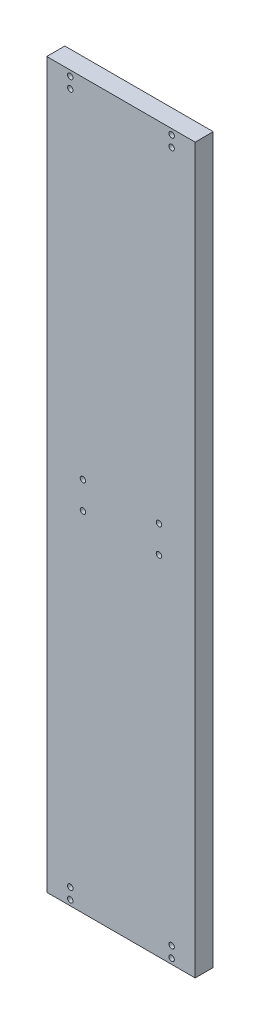
ISO-10303-21;
HEADER;
FILE_DESCRIPTION(('STEP AP214'),'2;1');
FILE_NAME('part.step','',(''),(''),'','','');
FILE_SCHEMA(('AUTOMOTIVE_DESIGN { 1 0 10303 214 1 1 1 1 }'));
ENDSEC;
DATA;
#1=APPLICATION_CONTEXT('core data for automotive mechanical design processes');
#2=APPLICATION_PROTOCOL_DEFINITION('international standard','automotive_design',2000,#1);
#3=PRODUCT_CONTEXT('',#1,'mechanical');
#4=PRODUCT('Part','Part','',(#3));
#5=PRODUCT_RELATED_PRODUCT_CATEGORY('part','',(#4));
#6=PRODUCT_DEFINITION_FORMATION('','',#4);
#7=PRODUCT_DEFINITION_CONTEXT('part definition',#1,'design');
#8=PRODUCT_DEFINITION('design','',#6,#7);
#9=PRODUCT_DEFINITION_SHAPE('','',#8);
#10=(LENGTH_UNIT() NAMED_UNIT(*) SI_UNIT(.MILLI.,.METRE.));
#11=(NAMED_UNIT(*) PLANE_ANGLE_UNIT() SI_UNIT($,.RADIAN.));
#12=(NAMED_UNIT(*) SI_UNIT($,.STERADIAN.) SOLID_ANGLE_UNIT());
#13=UNCERTAINTY_MEASURE_WITH_UNIT(LENGTH_MEASURE(1.E-05),#10,'distance_accuracy_value','');
#14=(GEOMETRIC_REPRESENTATION_CONTEXT(3) GLOBAL_UNCERTAINTY_ASSIGNED_CONTEXT((#13)) GLOBAL_UNIT_ASSIGNED_CONTEXT((#10,
#11,#12)) REPRESENTATION_CONTEXT('',''));
#15=CARTESIAN_POINT('',(0.,0.,0.));
#16=DIRECTION('',(0.,0.,1.));
#17=DIRECTION('',(1.,0.,0.));
#18=AXIS2_PLACEMENT_3D('',#15,#16,#17);
#19=CARTESIAN_POINT('',(41.,200.,10.));
#20=DIRECTION('',(-1.,0.,0.));
#21=DIRECTION('',(0.,-1.,0.));
#22=AXIS2_PLACEMENT_3D('',#19,#20,#21);
#23=PLANE('',#22);
#24=DIRECTION('',(0.,1.,0.));
#25=VECTOR('',#24,1.);
#26=CARTESIAN_POINT('',(41.,200.,0.));
#27=LINE('',#26,#25);
#28=CARTESIAN_POINT('',(41.,-200.,0.));
#29=VERTEX_POINT('',#28);
#30=CARTESIAN_POINT('',(41.,200.,0.));
#31=VERTEX_POINT('',#30);
#32=EDGE_CURVE('E97',#29,#31,#27,.T.);
#33=ORIENTED_EDGE('',*,*,#32,.T.);
#34=DIRECTION('',(0.,0.,-1.));
#35=VECTOR('',#34,1.);
#36=CARTESIAN_POINT('',(41.,200.,10.));
#37=LINE('',#36,#35);
#38=CARTESIAN_POINT('',(41.,200.,10.));
#39=VERTEX_POINT('',#38);
#40=EDGE_CURVE('E11',#39,#31,#37,.T.);
#41=ORIENTED_EDGE('',*,*,#40,.F.);
#42=DIRECTION('',(0.,1.,0.));
#43=VECTOR('',#42,1.);
#44=CARTESIAN_POINT('',(41.,200.,10.));
#45=LINE('',#44,#43);
#46=CARTESIAN_POINT('',(41.,-200.,10.));
#47=VERTEX_POINT('',#46);
#48=EDGE_CURVE('E85',#47,#39,#45,.T.);
#49=ORIENTED_EDGE('',*,*,#48,.F.);
#50=DIRECTION('',(0.,0.,-1.));
#51=VECTOR('',#50,1.);
#52=CARTESIAN_POINT('',(41.,-200.,10.));
#53=LINE('',#52,#51);
#54=EDGE_CURVE('E93',#47,#29,#53,.T.);
#55=ORIENTED_EDGE('',*,*,#54,.T.);
#56=EDGE_LOOP('',(#33,#41,#49,#55));
#57=FACE_BOUND('',#56,.T.);
#58=ADVANCED_FACE('F34',(#57),#23,.F.);
#59=CARTESIAN_POINT('',(-41.,200.,10.));
#60=DIRECTION('',(0.,-1.,0.));
#61=DIRECTION('',(0.,0.,-1.));
#62=AXIS2_PLACEMENT_3D('',#59,#60,#61);
#63=PLANE('',#62);
#64=DIRECTION('',(-1.,0.,0.));
#65=VECTOR('',#64,1.);
#66=CARTESIAN_POINT('',(-41.,200.,0.));
#67=LINE('',#66,#65);
#68=CARTESIAN_POINT('',(-41.,200.,0.));
#69=VERTEX_POINT('',#68);
#70=EDGE_CURVE('E89',#31,#69,#67,.T.);
#71=ORIENTED_EDGE('',*,*,#70,.T.);
#72=DIRECTION('',(0.,0.,-1.));
#73=VECTOR('',#72,1.);
#74=CARTESIAN_POINT('',(-41.,200.,10.));
#75=LINE('',#74,#73);
#76=CARTESIAN_POINT('',(-41.,200.,10.));
#77=VERTEX_POINT('',#76);
#78=EDGE_CURVE('E42',#77,#69,#75,.T.);
#79=ORIENTED_EDGE('',*,*,#78,.F.);
#80=DIRECTION('',(-1.,0.,0.));
#81=VECTOR('',#80,1.);
#82=CARTESIAN_POINT('',(-41.,200.,10.));
#83=LINE('',#82,#81);
#84=EDGE_CURVE('E80',#39,#77,#83,.T.);
#85=ORIENTED_EDGE('',*,*,#84,.F.);
#86=ORIENTED_EDGE('',*,*,#40,.T.);
#87=EDGE_LOOP('',(#71,#79,#85,#86));
#88=FACE_BOUND('',#87,.T.);
#89=ADVANCED_FACE('F88',(#88),#63,.F.);
#90=CARTESIAN_POINT('',(-41.,200.,10.));
#91=DIRECTION('',(1.,0.,0.));
#92=DIRECTION('',(0.,1.,0.));
#93=AXIS2_PLACEMENT_3D('',#90,#91,#92);
#94=PLANE('',#93);
#95=DIRECTION('',(0.,-1.,0.));
#96=VECTOR('',#95,1.);
#97=CARTESIAN_POINT('',(-41.,200.,0.));
#98=LINE('',#97,#96);
#99=CARTESIAN_POINT('',(-41.,-200.,0.));
#100=VERTEX_POINT('',#99);
#101=EDGE_CURVE('E67',#69,#100,#98,.T.);
#102=ORIENTED_EDGE('',*,*,#101,.T.);
#103=DIRECTION('',(0.,0.,-1.));
#104=VECTOR('',#103,1.);
#105=CARTESIAN_POINT('',(-41.,-200.,10.));
#106=LINE('',#105,#104);
#107=CARTESIAN_POINT('',(-41.,-200.,10.));
#108=VERTEX_POINT('',#107);
#109=EDGE_CURVE('E90',#108,#100,#106,.T.);
#110=ORIENTED_EDGE('',*,*,#109,.F.);
#111=DIRECTION('',(0.,-1.,0.));
#112=VECTOR('',#111,1.);
#113=CARTESIAN_POINT('',(-41.,200.,10.));
#114=LINE('',#113,#112);
#115=EDGE_CURVE('E83',#77,#108,#114,.T.);
#116=ORIENTED_EDGE('',*,*,#115,.F.);
#117=ORIENTED_EDGE('',*,*,#78,.T.);
#118=EDGE_LOOP('',(#102,#110,#116,#117));
#119=FACE_BOUND('',#118,.T.);
#120=ADVANCED_FACE('F91',(#119),#94,.F.);
#121=CARTESIAN_POINT('',(-41.,-200.,10.));
#122=DIRECTION('',(0.,1.,0.));
#123=DIRECTION('',(0.,0.,1.));
#124=AXIS2_PLACEMENT_3D('',#121,#122,#123);
#125=PLANE('',#124);
#126=DIRECTION('',(1.,0.,0.));
#127=VECTOR('',#126,1.);
#128=CARTESIAN_POINT('',(-41.,-200.,0.));
#129=LINE('',#128,#127);
#130=EDGE_CURVE('E73',#100,#29,#129,.T.);
#131=ORIENTED_EDGE('',*,*,#130,.T.);
#132=ORIENTED_EDGE('',*,*,#54,.F.);
#133=DIRECTION('',(1.,0.,0.));
#134=VECTOR('',#133,1.);
#135=CARTESIAN_POINT('',(-41.,-200.,10.));
#136=LINE('',#135,#134);
#137=EDGE_CURVE('E50',#108,#47,#136,.T.);
#138=ORIENTED_EDGE('',*,*,#137,.F.);
#139=ORIENTED_EDGE('',*,*,#109,.T.);
#140=EDGE_LOOP('',(#131,#132,#138,#139));
#141=FACE_BOUND('',#140,.T.);
#142=ADVANCED_FACE('F105',(#141),#125,.F.);
#143=CARTESIAN_POINT('',(0.,0.,10.));
#144=DIRECTION('',(0.,0.,1.));
#145=DIRECTION('',(1.,0.,0.));
#146=AXIS2_PLACEMENT_3D('',#143,#144,#145);
#147=PLANE('',#146);
#148=CARTESIAN_POINT('',(21.,7.49999999999995,10.));
#149=DIRECTION('',(0.,0.,-1.));
#150=DIRECTION('',(-1.,0.,0.));
#151=AXIS2_PLACEMENT_3D('',#148,#149,#150);
#152=CIRCLE('',#151,1.5);
#153=CARTESIAN_POINT('',(19.5,7.49999999999995,10.));
#154=VERTEX_POINT('',#153);
#155=EDGE_CURVE('E177',#154,#154,#152,.T.);
#156=ORIENTED_EDGE('',*,*,#155,.T.);
#157=EDGE_LOOP('',(#156));
#158=FACE_BOUND('',#157,.T.);
#159=CARTESIAN_POINT('',(21.,-7.50000000000005,10.));
#160=DIRECTION('',(0.,0.,-1.));
#161=DIRECTION('',(-1.,0.,0.));
#162=AXIS2_PLACEMENT_3D('',#159,#160,#161);
#163=CIRCLE('',#162,1.5);
#164=CARTESIAN_POINT('',(19.5,-7.50000000000005,10.));
#165=VERTEX_POINT('',#164);
#166=EDGE_CURVE('E171',#165,#165,#163,.T.);
#167=ORIENTED_EDGE('',*,*,#166,.T.);
#168=EDGE_LOOP('',(#167));
#169=FACE_BOUND('',#168,.T.);
#170=CARTESIAN_POINT('',(-21.,7.49999999999995,10.));
#171=DIRECTION('',(0.,0.,1.));
#172=DIRECTION('',(1.,0.,0.));
#173=AXIS2_PLACEMENT_3D('',#170,#171,#172);
#174=CIRCLE('',#173,1.5);
#175=CARTESIAN_POINT('',(-19.5,7.49999999999995,10.));
#176=VERTEX_POINT('',#175);
#177=EDGE_CURVE('E166',#176,#176,#174,.T.);
#178=ORIENTED_EDGE('',*,*,#177,.F.);
#179=EDGE_LOOP('',(#178));
#180=FACE_BOUND('',#179,.T.);
#181=CARTESIAN_POINT('',(-21.,-7.50000000000005,10.));
#182=DIRECTION('',(0.,0.,1.));
#183=DIRECTION('',(1.,0.,0.));
#184=AXIS2_PLACEMENT_3D('',#181,#182,#183);
#185=CIRCLE('',#184,1.5);
#186=CARTESIAN_POINT('',(-19.5,-7.50000000000005,10.));
#187=VERTEX_POINT('',#186);
#188=EDGE_CURVE('E159',#187,#187,#185,.T.);
#189=ORIENTED_EDGE('',*,*,#188,.F.);
#190=EDGE_LOOP('',(#189));
#191=FACE_BOUND('',#190,.T.);
#192=CARTESIAN_POINT('',(28.,191.,10.));
#193=DIRECTION('',(0.,0.,-1.));
#194=DIRECTION('',(1.,0.,0.));
#195=AXIS2_PLACEMENT_3D('',#192,#193,#194);
#196=CIRCLE('',#195,1.5);
#197=CARTESIAN_POINT('',(29.5,191.,10.));
#198=VERTEX_POINT('',#197);
#199=EDGE_CURVE('E148',#198,#198,#196,.T.);
#200=ORIENTED_EDGE('',*,*,#199,.T.);
#201=EDGE_LOOP('',(#200));
#202=FACE_BOUND('',#201,.T.);
#203=CARTESIAN_POINT('',(-28.,197.,10.));
#204=DIRECTION('',(0.,0.,-1.));
#205=DIRECTION('',(1.,0.,0.));
#206=AXIS2_PLACEMENT_3D('',#203,#204,#205);
#207=CIRCLE('',#206,1.5);
#208=CARTESIAN_POINT('',(-26.5,197.,10.));
#209=VERTEX_POINT('',#208);
#210=EDGE_CURVE('E141',#209,#209,#207,.T.);
#211=ORIENTED_EDGE('',*,*,#210,.T.);
#212=EDGE_LOOP('',(#211));
#213=FACE_BOUND('',#212,.T.);
#214=CARTESIAN_POINT('',(-28.,191.,10.));
#215=DIRECTION('',(0.,0.,-1.));
#216=DIRECTION('',(1.,0.,0.));
#217=AXIS2_PLACEMENT_3D('',#214,#215,#216);
#218=CIRCLE('',#217,1.5);
#219=CARTESIAN_POINT('',(-26.5,191.,10.));
#220=VERTEX_POINT('',#219);
#221=EDGE_CURVE('E153',#220,#220,#218,.T.);
#222=ORIENTED_EDGE('',*,*,#221,.T.);
#223=EDGE_LOOP('',(#222));
#224=FACE_BOUND('',#223,.T.);
#225=CARTESIAN_POINT('',(28.,197.,10.));
#226=DIRECTION('',(0.,0.,-1.));
#227=DIRECTION('',(1.,0.,0.));
#228=AXIS2_PLACEMENT_3D('',#225,#226,#227);
#229=CIRCLE('',#228,1.5);
#230=CARTESIAN_POINT('',(29.5,197.,10.));
#231=VERTEX_POINT('',#230);
#232=EDGE_CURVE('E135',#231,#231,#229,.T.);
#233=ORIENTED_EDGE('',*,*,#232,.T.);
#234=EDGE_LOOP('',(#233));
#235=FACE_BOUND('',#234,.T.);
#236=CARTESIAN_POINT('',(28.,-191.,10.));
#237=DIRECTION('',(0.,0.,1.));
#238=DIRECTION('',(1.,0.,0.));
#239=AXIS2_PLACEMENT_3D('',#236,#237,#238);
#240=CIRCLE('',#239,1.5);
#241=CARTESIAN_POINT('',(29.5,-191.,10.));
#242=VERTEX_POINT('',#241);
#243=EDGE_CURVE('E124',#242,#242,#240,.T.);
#244=ORIENTED_EDGE('',*,*,#243,.F.);
#245=EDGE_LOOP('',(#244));
#246=FACE_BOUND('',#245,.T.);
#247=CARTESIAN_POINT('',(-28.,-197.,10.));
#248=DIRECTION('',(0.,0.,1.));
#249=DIRECTION('',(1.,0.,0.));
#250=AXIS2_PLACEMENT_3D('',#247,#248,#249);
#251=CIRCLE('',#250,1.5);
#252=CARTESIAN_POINT('',(-26.5,-197.,10.));
#253=VERTEX_POINT('',#252);
#254=EDGE_CURVE('E117',#253,#253,#251,.T.);
#255=ORIENTED_EDGE('',*,*,#254,.F.);
#256=EDGE_LOOP('',(#255));
#257=FACE_BOUND('',#256,.T.);
#258=CARTESIAN_POINT('',(-28.,-191.,10.));
#259=DIRECTION('',(0.,0.,1.));
#260=DIRECTION('',(1.,0.,0.));
#261=AXIS2_PLACEMENT_3D('',#258,#259,#260);
#262=CIRCLE('',#261,1.5);
#263=CARTESIAN_POINT('',(-26.5,-191.,10.));
#264=VERTEX_POINT('',#263);
#265=EDGE_CURVE('E129',#264,#264,#262,.T.);
#266=ORIENTED_EDGE('',*,*,#265,.F.);
#267=EDGE_LOOP('',(#266));
#268=FACE_BOUND('',#267,.T.);
#269=CARTESIAN_POINT('',(28.,-197.,10.));
#270=DIRECTION('',(0.,0.,1.));
#271=DIRECTION('',(1.,0.,0.));
#272=AXIS2_PLACEMENT_3D('',#269,#270,#271);
#273=CIRCLE('',#272,1.5);
#274=CARTESIAN_POINT('',(29.5,-197.,10.));
#275=VERTEX_POINT('',#274);
#276=EDGE_CURVE('E111',#275,#275,#273,.T.);
#277=ORIENTED_EDGE('',*,*,#276,.F.);
#278=EDGE_LOOP('',(#277));
#279=FACE_BOUND('',#278,.T.);
#280=ORIENTED_EDGE('',*,*,#48,.T.);
#281=ORIENTED_EDGE('',*,*,#84,.T.);
#282=ORIENTED_EDGE('',*,*,#115,.T.);
#283=ORIENTED_EDGE('',*,*,#137,.T.);
#284=EDGE_LOOP('',(#280,#281,#282,#283));
#285=FACE_BOUND('',#284,.T.);
#286=ADVANCED_FACE('F81',(#158,#169,#180,#191,#202,#213,#224,#235,#246,#257,#268,#279,#285),
#147,.T.);
#287=CARTESIAN_POINT('',(0.,0.,0.));
#288=DIRECTION('',(0.,0.,1.));
#289=DIRECTION('',(1.,0.,0.));
#290=AXIS2_PLACEMENT_3D('',#287,#288,#289);
#291=PLANE('',#290);
#292=CARTESIAN_POINT('',(21.,7.49999999999995,0.));
#293=DIRECTION('',(0.,0.,-1.));
#294=DIRECTION('',(-1.,0.,0.));
#295=AXIS2_PLACEMENT_3D('',#292,#293,#294);
#296=CIRCLE('',#295,1.5);
#297=CARTESIAN_POINT('',(19.5,7.49999999999995,0.));
#298=VERTEX_POINT('',#297);
#299=EDGE_CURVE('E163',#298,#298,#296,.T.);
#300=ORIENTED_EDGE('',*,*,#299,.F.);
#301=EDGE_LOOP('',(#300));
#302=FACE_BOUND('',#301,.T.);
#303=CARTESIAN_POINT('',(21.,-7.50000000000005,0.));
#304=DIRECTION('',(0.,0.,-1.));
#305=DIRECTION('',(-1.,0.,0.));
#306=AXIS2_PLACEMENT_3D('',#303,#304,#305);
#307=CIRCLE('',#306,1.5);
#308=CARTESIAN_POINT('',(19.5,-7.50000000000005,0.));
#309=VERTEX_POINT('',#308);
#310=EDGE_CURVE('E174',#309,#309,#307,.T.);
#311=ORIENTED_EDGE('',*,*,#310,.F.);
#312=EDGE_LOOP('',(#311));
#313=FACE_BOUND('',#312,.T.);
#314=CARTESIAN_POINT('',(-21.,7.49999999999995,0.));
#315=DIRECTION('',(0.,0.,1.));
#316=DIRECTION('',(1.,0.,0.));
#317=AXIS2_PLACEMENT_3D('',#314,#315,#316);
#318=CIRCLE('',#317,1.5);
#319=CARTESIAN_POINT('',(-19.5,7.49999999999995,0.));
#320=VERTEX_POINT('',#319);
#321=EDGE_CURVE('E156',#320,#320,#318,.T.);
#322=ORIENTED_EDGE('',*,*,#321,.T.);
#323=EDGE_LOOP('',(#322));
#324=FACE_BOUND('',#323,.T.);
#325=CARTESIAN_POINT('',(-21.,-7.50000000000005,0.));
#326=DIRECTION('',(0.,0.,1.));
#327=DIRECTION('',(1.,0.,0.));
#328=AXIS2_PLACEMENT_3D('',#325,#326,#327);
#329=CIRCLE('',#328,1.5);
#330=CARTESIAN_POINT('',(-19.5,-7.50000000000005,0.));
#331=VERTEX_POINT('',#330);
#332=EDGE_CURVE('E162',#331,#331,#329,.T.);
#333=ORIENTED_EDGE('',*,*,#332,.T.);
#334=EDGE_LOOP('',(#333));
#335=FACE_BOUND('',#334,.T.);
#336=ORIENTED_EDGE('',*,*,#32,.F.);
#337=ORIENTED_EDGE('',*,*,#130,.F.);
#338=ORIENTED_EDGE('',*,*,#101,.F.);
#339=ORIENTED_EDGE('',*,*,#70,.F.);
#340=EDGE_LOOP('',(#336,#337,#338,#339));
#341=FACE_BOUND('',#340,.T.);
#342=ADVANCED_FACE('F108',(#302,#313,#324,#335,#341),#291,.F.);
#343=CARTESIAN_POINT('',(28.,-197.,5.));
#344=DIRECTION('',(0.,0.,1.));
#345=DIRECTION('',(1.,0.,0.));
#346=AXIS2_PLACEMENT_3D('',#343,#344,#345);
#347=CYLINDRICAL_SURFACE('',#346,1.5);
#348=CARTESIAN_POINT('',(28.,-197.,5.));
#349=DIRECTION('',(0.,0.,1.));
#350=DIRECTION('',(1.,0.,0.));
#351=AXIS2_PLACEMENT_3D('',#348,#349,#350);
#352=CIRCLE('',#351,1.5);
#353=CARTESIAN_POINT('',(29.5,-197.,5.));
#354=VERTEX_POINT('',#353);
#355=EDGE_CURVE('E100',#354,#354,#352,.T.);
#356=ORIENTED_EDGE('',*,*,#355,.F.);
#357=EDGE_LOOP('',(#356));
#358=FACE_BOUND('',#357,.T.);
#359=ORIENTED_EDGE('',*,*,#276,.T.);
#360=EDGE_LOOP('',(#359));
#361=FACE_BOUND('',#360,.T.);
#362=ADVANCED_FACE('F188',(#358,#361),#347,.F.);
#363=CARTESIAN_POINT('',(28.,-197.,5.));
#364=DIRECTION('',(0.,0.,1.));
#365=DIRECTION('',(1.,0.,0.));
#366=AXIS2_PLACEMENT_3D('',#363,#364,#365);
#367=PLANE('',#366);
#368=ORIENTED_EDGE('',*,*,#355,.T.);
#369=EDGE_LOOP('',(#368));
#370=FACE_BOUND('',#369,.T.);
#371=ADVANCED_FACE('F225',(#370),#367,.T.);
#372=CARTESIAN_POINT('',(-28.,-191.,5.));
#373=DIRECTION('',(0.,0.,1.));
#374=DIRECTION('',(1.,0.,0.));
#375=AXIS2_PLACEMENT_3D('',#372,#373,#374);
#376=CYLINDRICAL_SURFACE('',#375,1.5);
#377=CARTESIAN_POINT('',(-28.,-191.,5.));
#378=DIRECTION('',(0.,0.,1.));
#379=DIRECTION('',(1.,0.,0.));
#380=AXIS2_PLACEMENT_3D('',#377,#378,#379);
#381=CIRCLE('',#380,1.5);
#382=CARTESIAN_POINT('',(-26.5,-191.,5.));
#383=VERTEX_POINT('',#382);
#384=EDGE_CURVE('E121',#383,#383,#381,.T.);
#385=ORIENTED_EDGE('',*,*,#384,.F.);
#386=EDGE_LOOP('',(#385));
#387=FACE_BOUND('',#386,.T.);
#388=ORIENTED_EDGE('',*,*,#265,.T.);
#389=EDGE_LOOP('',(#388));
#390=FACE_BOUND('',#389,.T.);
#391=ADVANCED_FACE('F231',(#387,#390),#376,.F.);
#392=CARTESIAN_POINT('',(-28.,-191.,5.));
#393=DIRECTION('',(0.,0.,1.));
#394=DIRECTION('',(1.,0.,0.));
#395=AXIS2_PLACEMENT_3D('',#392,#393,#394);
#396=PLANE('',#395);
#397=ORIENTED_EDGE('',*,*,#384,.T.);
#398=EDGE_LOOP('',(#397));
#399=FACE_BOUND('',#398,.T.);
#400=ADVANCED_FACE('F319',(#399),#396,.T.);
#401=CARTESIAN_POINT('',(-28.,-197.,5.));
#402=DIRECTION('',(0.,0.,1.));
#403=DIRECTION('',(1.,0.,0.));
#404=AXIS2_PLACEMENT_3D('',#401,#402,#403);
#405=CYLINDRICAL_SURFACE('',#404,1.5);
#406=CARTESIAN_POINT('',(-28.,-197.,5.));
#407=DIRECTION('',(0.,0.,1.));
#408=DIRECTION('',(1.,0.,0.));
#409=AXIS2_PLACEMENT_3D('',#406,#407,#408);
#410=CIRCLE('',#409,1.5);
#411=CARTESIAN_POINT('',(-26.5,-197.,5.));
#412=VERTEX_POINT('',#411);
#413=EDGE_CURVE('E120',#412,#412,#410,.T.);
#414=ORIENTED_EDGE('',*,*,#413,.F.);
#415=EDGE_LOOP('',(#414));
#416=FACE_BOUND('',#415,.T.);
#417=ORIENTED_EDGE('',*,*,#254,.T.);
#418=EDGE_LOOP('',(#417));
#419=FACE_BOUND('',#418,.T.);
#420=ADVANCED_FACE('F322',(#416,#419),#405,.F.);
#421=CARTESIAN_POINT('',(-28.,-197.,5.));
#422=DIRECTION('',(0.,0.,1.));
#423=DIRECTION('',(1.,0.,0.));
#424=AXIS2_PLACEMENT_3D('',#421,#422,#423);
#425=PLANE('',#424);
#426=ORIENTED_EDGE('',*,*,#413,.T.);
#427=EDGE_LOOP('',(#426));
#428=FACE_BOUND('',#427,.T.);
#429=ADVANCED_FACE('F333',(#428),#425,.T.);
#430=CARTESIAN_POINT('',(28.,-191.,5.));
#431=DIRECTION('',(0.,0.,1.));
#432=DIRECTION('',(1.,0.,0.));
#433=AXIS2_PLACEMENT_3D('',#430,#431,#432);
#434=CYLINDRICAL_SURFACE('',#433,1.5);
#435=CARTESIAN_POINT('',(28.,-191.,5.));
#436=DIRECTION('',(0.,0.,1.));
#437=DIRECTION('',(1.,0.,0.));
#438=AXIS2_PLACEMENT_3D('',#435,#436,#437);
#439=CIRCLE('',#438,1.5);
#440=CARTESIAN_POINT('',(29.5,-191.,5.));
#441=VERTEX_POINT('',#440);
#442=EDGE_CURVE('E114',#441,#441,#439,.T.);
#443=ORIENTED_EDGE('',*,*,#442,.F.);
#444=EDGE_LOOP('',(#443));
#445=FACE_BOUND('',#444,.T.);
#446=ORIENTED_EDGE('',*,*,#243,.T.);
#447=EDGE_LOOP('',(#446));
#448=FACE_BOUND('',#447,.T.);
#449=ADVANCED_FACE('F329',(#445,#448),#434,.F.);
#450=CARTESIAN_POINT('',(28.,-191.,5.));
#451=DIRECTION('',(0.,0.,1.));
#452=DIRECTION('',(1.,0.,0.));
#453=AXIS2_PLACEMENT_3D('',#450,#451,#452);
#454=PLANE('',#453);
#455=ORIENTED_EDGE('',*,*,#442,.T.);
#456=EDGE_LOOP('',(#455));
#457=FACE_BOUND('',#456,.T.);
#458=ADVANCED_FACE('F317',(#457),#454,.T.);
#459=CARTESIAN_POINT('',(28.,197.,5.));
#460=DIRECTION('',(0.,0.,1.));
#461=DIRECTION('',(1.,0.,0.));
#462=AXIS2_PLACEMENT_3D('',#459,#460,#461);
#463=CYLINDRICAL_SURFACE('',#462,1.5);
#464=CARTESIAN_POINT('',(28.,197.,5.));
#465=DIRECTION('',(0.,0.,-1.));
#466=DIRECTION('',(1.,0.,0.));
#467=AXIS2_PLACEMENT_3D('',#464,#465,#466);
#468=CIRCLE('',#467,1.5);
#469=CARTESIAN_POINT('',(29.5,197.,5.));
#470=VERTEX_POINT('',#469);
#471=EDGE_CURVE('E132',#470,#470,#468,.T.);
#472=ORIENTED_EDGE('',*,*,#471,.T.);
#473=EDGE_LOOP('',(#472));
#474=FACE_BOUND('',#473,.T.);
#475=ORIENTED_EDGE('',*,*,#232,.F.);
#476=EDGE_LOOP('',(#475));
#477=FACE_BOUND('',#476,.T.);
#478=ADVANCED_FACE('F313',(#474,#477),#463,.F.);
#479=CARTESIAN_POINT('',(28.,197.,5.));
#480=DIRECTION('',(0.,0.,1.));
#481=DIRECTION('',(1.,0.,0.));
#482=AXIS2_PLACEMENT_3D('',#479,#480,#481);
#483=PLANE('',#482);
#484=ORIENTED_EDGE('',*,*,#471,.F.);
#485=EDGE_LOOP('',(#484));
#486=FACE_BOUND('',#485,.T.);
#487=ADVANCED_FACE('F295',(#486),#483,.T.);
#488=CARTESIAN_POINT('',(-28.,191.,5.));
#489=DIRECTION('',(0.,0.,1.));
#490=DIRECTION('',(1.,0.,0.));
#491=AXIS2_PLACEMENT_3D('',#488,#489,#490);
#492=CYLINDRICAL_SURFACE('',#491,1.5);
#493=CARTESIAN_POINT('',(-28.,191.,5.));
#494=DIRECTION('',(0.,0.,-1.));
#495=DIRECTION('',(1.,0.,0.));
#496=AXIS2_PLACEMENT_3D('',#493,#494,#495);
#497=CIRCLE('',#496,1.5);
#498=CARTESIAN_POINT('',(-26.5,191.,5.));
#499=VERTEX_POINT('',#498);
#500=EDGE_CURVE('E145',#499,#499,#497,.T.);
#501=ORIENTED_EDGE('',*,*,#500,.T.);
#502=EDGE_LOOP('',(#501));
#503=FACE_BOUND('',#502,.T.);
#504=ORIENTED_EDGE('',*,*,#221,.F.);
#505=EDGE_LOOP('',(#504));
#506=FACE_BOUND('',#505,.T.);
#507=ADVANCED_FACE('F291',(#503,#506),#492,.F.);
#508=CARTESIAN_POINT('',(-28.,191.,5.));
#509=DIRECTION('',(0.,0.,1.));
#510=DIRECTION('',(1.,0.,0.));
#511=AXIS2_PLACEMENT_3D('',#508,#509,#510);
#512=PLANE('',#511);
#513=ORIENTED_EDGE('',*,*,#500,.F.);
#514=EDGE_LOOP('',(#513));
#515=FACE_BOUND('',#514,.T.);
#516=ADVANCED_FACE('F287',(#515),#512,.T.);
#517=CARTESIAN_POINT('',(-28.,197.,5.));
#518=DIRECTION('',(0.,0.,1.));
#519=DIRECTION('',(1.,0.,0.));
#520=AXIS2_PLACEMENT_3D('',#517,#518,#519);
#521=CYLINDRICAL_SURFACE('',#520,1.5);
#522=CARTESIAN_POINT('',(-28.,197.,5.));
#523=DIRECTION('',(0.,0.,-1.));
#524=DIRECTION('',(1.,0.,0.));
#525=AXIS2_PLACEMENT_3D('',#522,#523,#524);
#526=CIRCLE('',#525,1.5);
#527=CARTESIAN_POINT('',(-26.5,197.,5.));
#528=VERTEX_POINT('',#527);
#529=EDGE_CURVE('E144',#528,#528,#526,.T.);
#530=ORIENTED_EDGE('',*,*,#529,.T.);
#531=EDGE_LOOP('',(#530));
#532=FACE_BOUND('',#531,.T.);
#533=ORIENTED_EDGE('',*,*,#210,.F.);
#534=EDGE_LOOP('',(#533));
#535=FACE_BOUND('',#534,.T.);
#536=ADVANCED_FACE('F290',(#532,#535),#521,.F.);
#537=CARTESIAN_POINT('',(-28.,197.,5.));
#538=DIRECTION('',(0.,0.,1.));
#539=DIRECTION('',(1.,0.,0.));
#540=AXIS2_PLACEMENT_3D('',#537,#538,#539);
#541=PLANE('',#540);
#542=ORIENTED_EDGE('',*,*,#529,.F.);
#543=EDGE_LOOP('',(#542));
#544=FACE_BOUND('',#543,.T.);
#545=ADVANCED_FACE('F303',(#544),#541,.T.);
#546=CARTESIAN_POINT('',(28.,191.,5.));
#547=DIRECTION('',(0.,0.,1.));
#548=DIRECTION('',(1.,0.,0.));
#549=AXIS2_PLACEMENT_3D('',#546,#547,#548);
#550=CYLINDRICAL_SURFACE('',#549,1.5);
#551=CARTESIAN_POINT('',(28.,191.,5.));
#552=DIRECTION('',(0.,0.,-1.));
#553=DIRECTION('',(1.,0.,0.));
#554=AXIS2_PLACEMENT_3D('',#551,#552,#553);
#555=CIRCLE('',#554,1.5);
#556=CARTESIAN_POINT('',(29.5,191.,5.));
#557=VERTEX_POINT('',#556);
#558=EDGE_CURVE('E138',#557,#557,#555,.T.);
#559=ORIENTED_EDGE('',*,*,#558,.T.);
#560=EDGE_LOOP('',(#559));
#561=FACE_BOUND('',#560,.T.);
#562=ORIENTED_EDGE('',*,*,#199,.F.);
#563=EDGE_LOOP('',(#562));
#564=FACE_BOUND('',#563,.T.);
#565=ADVANCED_FACE('F299',(#561,#564),#550,.F.);
#566=CARTESIAN_POINT('',(28.,191.,5.));
#567=DIRECTION('',(0.,0.,1.));
#568=DIRECTION('',(1.,0.,0.));
#569=AXIS2_PLACEMENT_3D('',#566,#567,#568);
#570=PLANE('',#569);
#571=ORIENTED_EDGE('',*,*,#558,.F.);
#572=EDGE_LOOP('',(#571));
#573=FACE_BOUND('',#572,.T.);
#574=ADVANCED_FACE('F200',(#573),#570,.T.);
#575=CARTESIAN_POINT('',(-21.,-7.50000000000005,0.));
#576=DIRECTION('',(0.,0.,1.));
#577=DIRECTION('',(1.,0.,0.));
#578=AXIS2_PLACEMENT_3D('',#575,#576,#577);
#579=CYLINDRICAL_SURFACE('',#578,1.5);
#580=ORIENTED_EDGE('',*,*,#332,.F.);
#581=EDGE_LOOP('',(#580));
#582=FACE_BOUND('',#581,.T.);
#583=ORIENTED_EDGE('',*,*,#188,.T.);
#584=EDGE_LOOP('',(#583));
#585=FACE_BOUND('',#584,.T.);
#586=ADVANCED_FACE('F196',(#582,#585),#579,.F.);
#587=CARTESIAN_POINT('',(-21.,7.49999999999995,0.));
#588=DIRECTION('',(0.,0.,1.));
#589=DIRECTION('',(1.,0.,0.));
#590=AXIS2_PLACEMENT_3D('',#587,#588,#589);
#591=CYLINDRICAL_SURFACE('',#590,1.5);
#592=ORIENTED_EDGE('',*,*,#321,.F.);
#593=EDGE_LOOP('',(#592));
#594=FACE_BOUND('',#593,.T.);
#595=ORIENTED_EDGE('',*,*,#177,.T.);
#596=EDGE_LOOP('',(#595));
#597=FACE_BOUND('',#596,.T.);
#598=ADVANCED_FACE('F199',(#594,#597),#591,.F.);
#599=CARTESIAN_POINT('',(21.,-7.50000000000005,0.));
#600=DIRECTION('',(0.,0.,1.));
#601=DIRECTION('',(1.,0.,0.));
#602=AXIS2_PLACEMENT_3D('',#599,#600,#601);
#603=CYLINDRICAL_SURFACE('',#602,1.5);
#604=ORIENTED_EDGE('',*,*,#310,.T.);
#605=EDGE_LOOP('',(#604));
#606=FACE_BOUND('',#605,.T.);
#607=ORIENTED_EDGE('',*,*,#166,.F.);
#608=EDGE_LOOP('',(#607));
#609=FACE_BOUND('',#608,.T.);
#610=ADVANCED_FACE('F265',(#606,#609),#603,.F.);
#611=CARTESIAN_POINT('',(21.,7.49999999999995,0.));
#612=DIRECTION('',(0.,0.,1.));
#613=DIRECTION('',(1.,0.,0.));
#614=AXIS2_PLACEMENT_3D('',#611,#612,#613);
#615=CYLINDRICAL_SURFACE('',#614,1.5);
#616=ORIENTED_EDGE('',*,*,#299,.T.);
#617=EDGE_LOOP('',(#616));
#618=FACE_BOUND('',#617,.T.);
#619=ORIENTED_EDGE('',*,*,#155,.F.);
#620=EDGE_LOOP('',(#619));
#621=FACE_BOUND('',#620,.T.);
#622=ADVANCED_FACE('F183',(#618,#621),#615,.F.);
#623=CLOSED_SHELL('',(#58,#89,#120,#142,#286,#342,#362,#371,#391,#400,#420,#429,#449,#458,#478,
#487,#507,#516,#536,#545,#565,#574,#586,#598,#610,#622));
#624=MANIFOLD_SOLID_BREP('B2',#623);
#625=ADVANCED_BREP_SHAPE_REPRESENTATION('',(#18,#624),#14);
#626=SHAPE_DEFINITION_REPRESENTATION(#9,#625);
ENDSEC;
END-ISO-10303-21;
